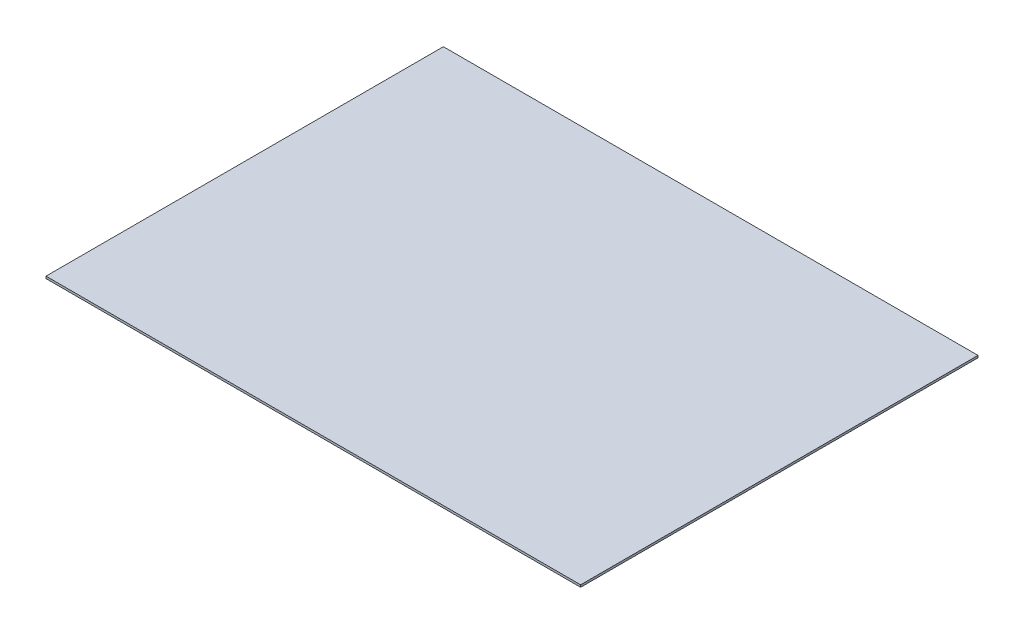
ISO-10303-21;
HEADER;
FILE_DESCRIPTION(('STEP AP214'),'2;1');
FILE_NAME('part.step','',(''),(''),'','','');
FILE_SCHEMA(('AUTOMOTIVE_DESIGN { 1 0 10303 214 1 1 1 1 }'));
ENDSEC;
DATA;
#1=APPLICATION_CONTEXT('core data for automotive mechanical design processes');
#2=APPLICATION_PROTOCOL_DEFINITION('international standard','automotive_design',2000,#1);
#3=PRODUCT_CONTEXT('',#1,'mechanical');
#4=PRODUCT('Part','Part','',(#3));
#5=PRODUCT_RELATED_PRODUCT_CATEGORY('part','',(#4));
#6=PRODUCT_DEFINITION_FORMATION('','',#4);
#7=PRODUCT_DEFINITION_CONTEXT('part definition',#1,'design');
#8=PRODUCT_DEFINITION('design','',#6,#7);
#9=PRODUCT_DEFINITION_SHAPE('','',#8);
#10=(LENGTH_UNIT() NAMED_UNIT(*) SI_UNIT(.MILLI.,.METRE.));
#11=(NAMED_UNIT(*) PLANE_ANGLE_UNIT() SI_UNIT($,.RADIAN.));
#12=(NAMED_UNIT(*) SI_UNIT($,.STERADIAN.) SOLID_ANGLE_UNIT());
#13=UNCERTAINTY_MEASURE_WITH_UNIT(LENGTH_MEASURE(1.E-05),#10,'distance_accuracy_value','');
#14=(GEOMETRIC_REPRESENTATION_CONTEXT(3) GLOBAL_UNCERTAINTY_ASSIGNED_CONTEXT((#13)) GLOBAL_UNIT_ASSIGNED_CONTEXT((#10,
#11,#12)) REPRESENTATION_CONTEXT('',''));
#15=CARTESIAN_POINT('',(0.,0.,0.));
#16=DIRECTION('',(0.,0.,1.));
#17=DIRECTION('',(1.,0.,0.));
#18=AXIS2_PLACEMENT_3D('',#15,#16,#17);
#19=CARTESIAN_POINT('',(-233.387422445409,2.54,-191.377686405235));
#20=DIRECTION('',(1.,0.,0.));
#21=DIRECTION('',(0.,0.,-1.));
#22=AXIS2_PLACEMENT_3D('',#19,#20,#21);
#23=PLANE('',#22);
#24=DIRECTION('',(0.,0.,1.));
#25=VECTOR('',#24,1.);
#26=CARTESIAN_POINT('',(-233.387422445409,0.,-191.377686405235));
#27=LINE('',#26,#25);
#28=CARTESIAN_POINT('',(-233.387422445409,0.,-191.377686405235));
#29=VERTEX_POINT('',#28);
#30=CARTESIAN_POINT('',(-233.387422445409,0.,273.530059106019));
#31=VERTEX_POINT('',#30);
#32=EDGE_CURVE('E101',#29,#31,#27,.T.);
#33=ORIENTED_EDGE('',*,*,#32,.T.);
#34=DIRECTION('',(0.,-1.,0.));
#35=VECTOR('',#34,1.);
#36=CARTESIAN_POINT('',(-233.387422445409,2.54,273.530059106019));
#37=LINE('',#36,#35);
#38=CARTESIAN_POINT('',(-233.387422445409,2.54,273.530059106019));
#39=VERTEX_POINT('',#38);
#40=EDGE_CURVE('E11',#39,#31,#37,.T.);
#41=ORIENTED_EDGE('',*,*,#40,.F.);
#42=DIRECTION('',(0.,0.,1.));
#43=VECTOR('',#42,1.);
#44=CARTESIAN_POINT('',(-233.387422445409,2.54,-191.377686405235));
#45=LINE('',#44,#43);
#46=CARTESIAN_POINT('',(-233.387422445409,2.54,-191.377686405235));
#47=VERTEX_POINT('',#46);
#48=EDGE_CURVE('E89',#47,#39,#45,.T.);
#49=ORIENTED_EDGE('',*,*,#48,.F.);
#50=DIRECTION('',(0.,-1.,0.));
#51=VECTOR('',#50,1.);
#52=CARTESIAN_POINT('',(-233.387422445409,2.54,-191.377686405235));
#53=LINE('',#52,#51);
#54=EDGE_CURVE('E97',#47,#29,#53,.T.);
#55=ORIENTED_EDGE('',*,*,#54,.T.);
#56=EDGE_LOOP('',(#33,#41,#49,#55));
#57=FACE_BOUND('',#56,.T.);
#58=ADVANCED_FACE('F38',(#57),#23,.F.);
#59=CARTESIAN_POINT('',(-233.387422445409,2.54,273.530059106019));
#60=DIRECTION('',(0.,0.,-1.));
#61=DIRECTION('',(-1.,0.,0.));
#62=AXIS2_PLACEMENT_3D('',#59,#60,#61);
#63=PLANE('',#62);
#64=DIRECTION('',(1.,0.,0.));
#65=VECTOR('',#64,1.);
#66=CARTESIAN_POINT('',(-233.387422445409,0.,273.530059106019));
#67=LINE('',#66,#65);
#68=CARTESIAN_POINT('',(392.090869708287,0.,273.530059106019));
#69=VERTEX_POINT('',#68);
#70=EDGE_CURVE('E93',#31,#69,#67,.T.);
#71=ORIENTED_EDGE('',*,*,#70,.T.);
#72=DIRECTION('',(0.,-1.,0.));
#73=VECTOR('',#72,1.);
#74=CARTESIAN_POINT('',(392.090869708287,2.54,273.530059106019));
#75=LINE('',#74,#73);
#76=CARTESIAN_POINT('',(392.090869708287,2.54,273.530059106019));
#77=VERTEX_POINT('',#76);
#78=EDGE_CURVE('E46',#77,#69,#75,.T.);
#79=ORIENTED_EDGE('',*,*,#78,.F.);
#80=DIRECTION('',(1.,0.,0.));
#81=VECTOR('',#80,1.);
#82=CARTESIAN_POINT('',(-233.387422445409,2.54,273.530059106019));
#83=LINE('',#82,#81);
#84=EDGE_CURVE('E84',#39,#77,#83,.T.);
#85=ORIENTED_EDGE('',*,*,#84,.F.);
#86=ORIENTED_EDGE('',*,*,#40,.T.);
#87=EDGE_LOOP('',(#71,#79,#85,#86));
#88=FACE_BOUND('',#87,.T.);
#89=ADVANCED_FACE('F92',(#88),#63,.F.);
#90=CARTESIAN_POINT('',(392.090869708287,2.54,-191.377686405235));
#91=DIRECTION('',(-1.,0.,0.));
#92=DIRECTION('',(0.,0.,1.));
#93=AXIS2_PLACEMENT_3D('',#90,#91,#92);
#94=PLANE('',#93);
#95=DIRECTION('',(0.,0.,-1.));
#96=VECTOR('',#95,1.);
#97=CARTESIAN_POINT('',(392.090869708287,0.,-191.377686405235));
#98=LINE('',#97,#96);
#99=CARTESIAN_POINT('',(392.090869708287,0.,-191.377686405235));
#100=VERTEX_POINT('',#99);
#101=EDGE_CURVE('E71',#69,#100,#98,.T.);
#102=ORIENTED_EDGE('',*,*,#101,.T.);
#103=DIRECTION('',(0.,-1.,0.));
#104=VECTOR('',#103,1.);
#105=CARTESIAN_POINT('',(392.090869708287,2.54,-191.377686405235));
#106=LINE('',#105,#104);
#107=CARTESIAN_POINT('',(392.090869708287,2.54,-191.377686405235));
#108=VERTEX_POINT('',#107);
#109=EDGE_CURVE('E94',#108,#100,#106,.T.);
#110=ORIENTED_EDGE('',*,*,#109,.F.);
#111=DIRECTION('',(0.,0.,-1.));
#112=VECTOR('',#111,1.);
#113=CARTESIAN_POINT('',(392.090869708287,2.54,-191.377686405235));
#114=LINE('',#113,#112);
#115=EDGE_CURVE('E87',#77,#108,#114,.T.);
#116=ORIENTED_EDGE('',*,*,#115,.F.);
#117=ORIENTED_EDGE('',*,*,#78,.T.);
#118=EDGE_LOOP('',(#102,#110,#116,#117));
#119=FACE_BOUND('',#118,.T.);
#120=ADVANCED_FACE('F95',(#119),#94,.F.);
#121=CARTESIAN_POINT('',(-233.387422445409,2.54,-191.377686405235));
#122=DIRECTION('',(0.,0.,1.));
#123=DIRECTION('',(1.,0.,0.));
#124=AXIS2_PLACEMENT_3D('',#121,#122,#123);
#125=PLANE('',#124);
#126=DIRECTION('',(-1.,0.,0.));
#127=VECTOR('',#126,1.);
#128=CARTESIAN_POINT('',(-233.387422445409,0.,-191.377686405235));
#129=LINE('',#128,#127);
#130=EDGE_CURVE('E77',#100,#29,#129,.T.);
#131=ORIENTED_EDGE('',*,*,#130,.T.);
#132=ORIENTED_EDGE('',*,*,#54,.F.);
#133=DIRECTION('',(-1.,0.,0.));
#134=VECTOR('',#133,1.);
#135=CARTESIAN_POINT('',(-233.387422445409,2.54,-191.377686405235));
#136=LINE('',#135,#134);
#137=EDGE_CURVE('E54',#108,#47,#136,.T.);
#138=ORIENTED_EDGE('',*,*,#137,.F.);
#139=ORIENTED_EDGE('',*,*,#109,.T.);
#140=EDGE_LOOP('',(#131,#132,#138,#139));
#141=FACE_BOUND('',#140,.T.);
#142=ADVANCED_FACE('F108',(#141),#125,.F.);
#143=CARTESIAN_POINT('',(0.,2.54,0.));
#144=DIRECTION('',(0.,1.,0.));
#145=DIRECTION('',(0.,0.,1.));
#146=AXIS2_PLACEMENT_3D('',#143,#144,#145);
#147=PLANE('',#146);
#148=ORIENTED_EDGE('',*,*,#48,.T.);
#149=ORIENTED_EDGE('',*,*,#84,.T.);
#150=ORIENTED_EDGE('',*,*,#115,.T.);
#151=ORIENTED_EDGE('',*,*,#137,.T.);
#152=EDGE_LOOP('',(#148,#149,#150,#151));
#153=FACE_BOUND('',#152,.T.);
#154=ADVANCED_FACE('F85',(#153),#147,.T.);
#155=CARTESIAN_POINT('',(0.,0.,0.));
#156=DIRECTION('',(0.,1.,0.));
#157=DIRECTION('',(0.,0.,1.));
#158=AXIS2_PLACEMENT_3D('',#155,#156,#157);
#159=PLANE('',#158);
#160=ORIENTED_EDGE('',*,*,#32,.F.);
#161=ORIENTED_EDGE('',*,*,#130,.F.);
#162=ORIENTED_EDGE('',*,*,#101,.F.);
#163=ORIENTED_EDGE('',*,*,#70,.F.);
#164=EDGE_LOOP('',(#160,#161,#162,#163));
#165=FACE_BOUND('',#164,.T.);
#166=ADVANCED_FACE('F111',(#165),#159,.F.);
#167=CLOSED_SHELL('',(#58,#89,#120,#142,#154,#166));
#168=MANIFOLD_SOLID_BREP('B2',#167);
#169=ADVANCED_BREP_SHAPE_REPRESENTATION('',(#18,#168),#14);
#170=SHAPE_DEFINITION_REPRESENTATION(#9,#169);
ENDSEC;
END-ISO-10303-21;
